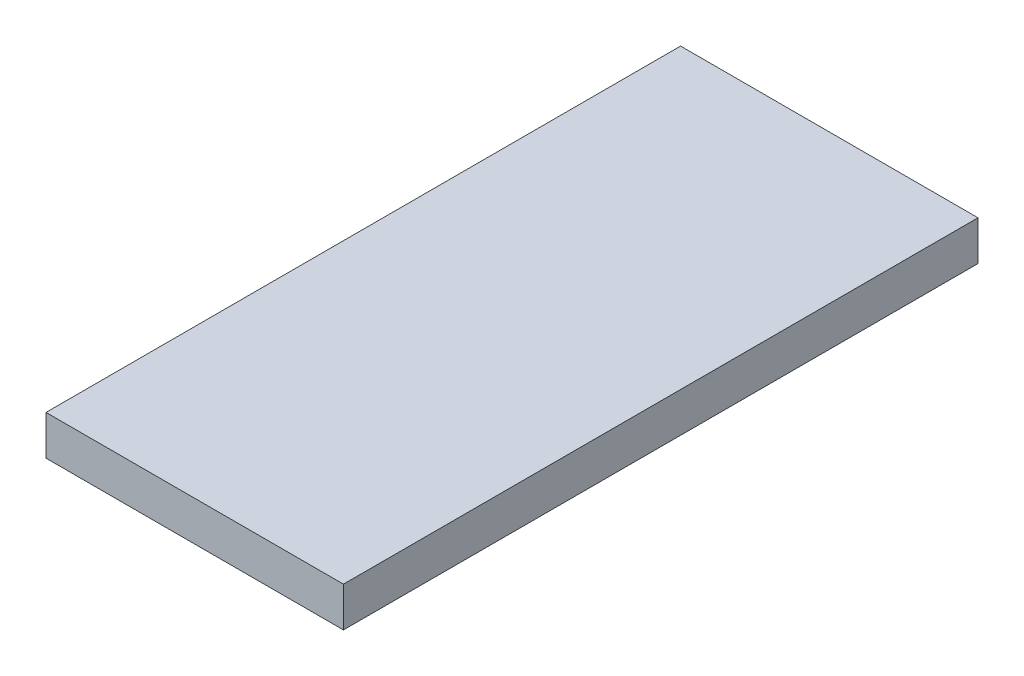
ISO-10303-21;
HEADER;
FILE_DESCRIPTION(('STEP AP214'),'2;1');
FILE_NAME('part.step','',(''),(''),'','','');
FILE_SCHEMA(('AUTOMOTIVE_DESIGN { 1 0 10303 214 1 1 1 1 }'));
ENDSEC;
DATA;
#1=APPLICATION_CONTEXT('core data for automotive mechanical design processes');
#2=APPLICATION_PROTOCOL_DEFINITION('international standard','automotive_design',2000,#1);
#3=PRODUCT_CONTEXT('',#1,'mechanical');
#4=PRODUCT('Part','Part','',(#3));
#5=PRODUCT_RELATED_PRODUCT_CATEGORY('part','',(#4));
#6=PRODUCT_DEFINITION_FORMATION('','',#4);
#7=PRODUCT_DEFINITION_CONTEXT('part definition',#1,'design');
#8=PRODUCT_DEFINITION('design','',#6,#7);
#9=PRODUCT_DEFINITION_SHAPE('','',#8);
#10=(LENGTH_UNIT() NAMED_UNIT(*) SI_UNIT(.MILLI.,.METRE.));
#11=(NAMED_UNIT(*) PLANE_ANGLE_UNIT() SI_UNIT($,.RADIAN.));
#12=(NAMED_UNIT(*) SI_UNIT($,.STERADIAN.) SOLID_ANGLE_UNIT());
#13=UNCERTAINTY_MEASURE_WITH_UNIT(LENGTH_MEASURE(1.E-05),#10,'distance_accuracy_value','');
#14=(GEOMETRIC_REPRESENTATION_CONTEXT(3) GLOBAL_UNCERTAINTY_ASSIGNED_CONTEXT((#13)) GLOBAL_UNIT_ASSIGNED_CONTEXT((#10,
#11,#12)) REPRESENTATION_CONTEXT('',''));
#15=CARTESIAN_POINT('',(0.,0.,0.));
#16=DIRECTION('',(0.,0.,1.));
#17=DIRECTION('',(1.,0.,0.));
#18=AXIS2_PLACEMENT_3D('',#15,#16,#17);
#19=CARTESIAN_POINT('',(0.,-3.95328338216217,320.));
#20=DIRECTION('',(0.,-1.,0.));
#21=DIRECTION('',(1.,0.,0.));
#22=AXIS2_PLACEMENT_3D('',#19,#20,#21);
#23=PLANE('',#22);
#24=DIRECTION('',(-1.,0.,0.));
#25=VECTOR('',#24,1.);
#26=CARTESIAN_POINT('',(0.,-3.95328338216217,0.));
#27=LINE('',#26,#25);
#28=CARTESIAN_POINT('',(86.8438874313117,-3.95328338216216,0.));
#29=VERTEX_POINT('',#28);
#30=CARTESIAN_POINT('',(-63.1561125686883,-3.95328338216218,0.));
#31=VERTEX_POINT('',#30);
#32=EDGE_CURVE('E98',#29,#31,#27,.T.);
#33=ORIENTED_EDGE('',*,*,#32,.F.);
#34=DIRECTION('',(0.,0.,-1.));
#35=VECTOR('',#34,1.);
#36=CARTESIAN_POINT('',(86.8438874313117,-3.95328338216216,320.));
#37=LINE('',#36,#35);
#38=CARTESIAN_POINT('',(86.8438874313117,-3.95328338216216,320.));
#39=VERTEX_POINT('',#38);
#40=EDGE_CURVE('E11',#39,#29,#37,.T.);
#41=ORIENTED_EDGE('',*,*,#40,.F.);
#42=DIRECTION('',(-1.,0.,0.));
#43=VECTOR('',#42,1.);
#44=CARTESIAN_POINT('',(0.,-3.95328338216217,320.));
#45=LINE('',#44,#43);
#46=CARTESIAN_POINT('',(-63.1561125686883,-3.95328338216218,320.));
#47=VERTEX_POINT('',#46);
#48=EDGE_CURVE('E90',#39,#47,#45,.T.);
#49=ORIENTED_EDGE('',*,*,#48,.T.);
#50=DIRECTION('',(0.,0.,-1.));
#51=VECTOR('',#50,1.);
#52=CARTESIAN_POINT('',(-63.1561125686883,-3.95328338216218,320.));
#53=LINE('',#52,#51);
#54=EDGE_CURVE('E51',#47,#31,#53,.T.);
#55=ORIENTED_EDGE('',*,*,#54,.T.);
#56=EDGE_LOOP('',(#33,#41,#49,#55));
#57=FACE_BOUND('',#56,.T.);
#58=ADVANCED_FACE('F35',(#57),#23,.T.);
#59=CARTESIAN_POINT('',(86.8438874313117,0.,320.));
#60=DIRECTION('',(1.,0.,0.));
#61=DIRECTION('',(0.,0.,-1.));
#62=AXIS2_PLACEMENT_3D('',#59,#60,#61);
#63=PLANE('',#62);
#64=DIRECTION('',(0.,-1.,0.));
#65=VECTOR('',#64,1.);
#66=CARTESIAN_POINT('',(86.8438874313117,0.,0.));
#67=LINE('',#66,#65);
#68=CARTESIAN_POINT('',(86.8438874313117,16.0467166178378,0.));
#69=VERTEX_POINT('',#68);
#70=EDGE_CURVE('E81',#69,#29,#67,.T.);
#71=ORIENTED_EDGE('',*,*,#70,.F.);
#72=DIRECTION('',(0.,0.,-1.));
#73=VECTOR('',#72,1.);
#74=CARTESIAN_POINT('',(86.8438874313117,16.0467166178378,320.));
#75=LINE('',#74,#73);
#76=CARTESIAN_POINT('',(86.8438874313117,16.0467166178378,320.));
#77=VERTEX_POINT('',#76);
#78=EDGE_CURVE('E43',#77,#69,#75,.T.);
#79=ORIENTED_EDGE('',*,*,#78,.F.);
#80=DIRECTION('',(0.,-1.,0.));
#81=VECTOR('',#80,1.);
#82=CARTESIAN_POINT('',(86.8438874313117,0.,320.));
#83=LINE('',#82,#81);
#84=EDGE_CURVE('E79',#77,#39,#83,.T.);
#85=ORIENTED_EDGE('',*,*,#84,.T.);
#86=ORIENTED_EDGE('',*,*,#40,.T.);
#87=EDGE_LOOP('',(#71,#79,#85,#86));
#88=FACE_BOUND('',#87,.T.);
#89=ADVANCED_FACE('F78',(#88),#63,.T.);
#90=CARTESIAN_POINT('',(0.,16.0467166178378,320.));
#91=DIRECTION('',(0.,1.,0.));
#92=DIRECTION('',(0.,0.,1.));
#93=AXIS2_PLACEMENT_3D('',#90,#91,#92);
#94=PLANE('',#93);
#95=DIRECTION('',(1.,0.,0.));
#96=VECTOR('',#95,1.);
#97=CARTESIAN_POINT('',(0.,16.0467166178378,0.));
#98=LINE('',#97,#96);
#99=CARTESIAN_POINT('',(-63.1561125686883,16.0467166178378,0.));
#100=VERTEX_POINT('',#99);
#101=EDGE_CURVE('E101',#100,#69,#98,.T.);
#102=ORIENTED_EDGE('',*,*,#101,.F.);
#103=DIRECTION('',(0.,0.,-1.));
#104=VECTOR('',#103,1.);
#105=CARTESIAN_POINT('',(-63.1561125686883,16.0467166178378,320.));
#106=LINE('',#105,#104);
#107=CARTESIAN_POINT('',(-63.1561125686883,16.0467166178378,320.));
#108=VERTEX_POINT('',#107);
#109=EDGE_CURVE('E64',#108,#100,#106,.T.);
#110=ORIENTED_EDGE('',*,*,#109,.F.);
#111=DIRECTION('',(1.,0.,0.));
#112=VECTOR('',#111,1.);
#113=CARTESIAN_POINT('',(0.,16.0467166178378,320.));
#114=LINE('',#113,#112);
#115=EDGE_CURVE('E89',#108,#77,#114,.T.);
#116=ORIENTED_EDGE('',*,*,#115,.T.);
#117=ORIENTED_EDGE('',*,*,#78,.T.);
#118=EDGE_LOOP('',(#102,#110,#116,#117));
#119=FACE_BOUND('',#118,.T.);
#120=ADVANCED_FACE('F92',(#119),#94,.T.);
#121=CARTESIAN_POINT('',(-63.1561125686883,0.,320.));
#122=DIRECTION('',(-1.,0.,0.));
#123=DIRECTION('',(0.,0.,1.));
#124=AXIS2_PLACEMENT_3D('',#121,#122,#123);
#125=PLANE('',#124);
#126=DIRECTION('',(0.,1.,0.));
#127=VECTOR('',#126,1.);
#128=CARTESIAN_POINT('',(-63.1561125686883,0.,0.));
#129=LINE('',#128,#127);
#130=EDGE_CURVE('E103',#31,#100,#129,.T.);
#131=ORIENTED_EDGE('',*,*,#130,.F.);
#132=ORIENTED_EDGE('',*,*,#54,.F.);
#133=DIRECTION('',(0.,1.,0.));
#134=VECTOR('',#133,1.);
#135=CARTESIAN_POINT('',(-63.1561125686883,0.,320.));
#136=LINE('',#135,#134);
#137=EDGE_CURVE('E93',#47,#108,#136,.T.);
#138=ORIENTED_EDGE('',*,*,#137,.T.);
#139=ORIENTED_EDGE('',*,*,#109,.T.);
#140=EDGE_LOOP('',(#131,#132,#138,#139));
#141=FACE_BOUND('',#140,.T.);
#142=ADVANCED_FACE('F108',(#141),#125,.T.);
#143=CARTESIAN_POINT('',(0.,0.,320.));
#144=DIRECTION('',(0.,0.,1.));
#145=DIRECTION('',(1.,0.,0.));
#146=AXIS2_PLACEMENT_3D('',#143,#144,#145);
#147=PLANE('',#146);
#148=ORIENTED_EDGE('',*,*,#48,.F.);
#149=ORIENTED_EDGE('',*,*,#84,.F.);
#150=ORIENTED_EDGE('',*,*,#115,.F.);
#151=ORIENTED_EDGE('',*,*,#137,.F.);
#152=EDGE_LOOP('',(#148,#149,#150,#151));
#153=FACE_BOUND('',#152,.T.);
#154=ADVANCED_FACE('F87',(#153),#147,.T.);
#155=CARTESIAN_POINT('',(0.,0.,0.));
#156=DIRECTION('',(0.,0.,1.));
#157=DIRECTION('',(1.,0.,0.));
#158=AXIS2_PLACEMENT_3D('',#155,#156,#157);
#159=PLANE('',#158);
#160=ORIENTED_EDGE('',*,*,#32,.T.);
#161=ORIENTED_EDGE('',*,*,#130,.T.);
#162=ORIENTED_EDGE('',*,*,#101,.T.);
#163=ORIENTED_EDGE('',*,*,#70,.T.);
#164=EDGE_LOOP('',(#160,#161,#162,#163));
#165=FACE_BOUND('',#164,.T.);
#166=ADVANCED_FACE('F115',(#165),#159,.F.);
#167=CLOSED_SHELL('',(#58,#89,#120,#142,#154,#166));
#168=MANIFOLD_SOLID_BREP('B2',#167);
#169=ADVANCED_BREP_SHAPE_REPRESENTATION('',(#18,#168),#14);
#170=SHAPE_DEFINITION_REPRESENTATION(#9,#169);
ENDSEC;
END-ISO-10303-21;
